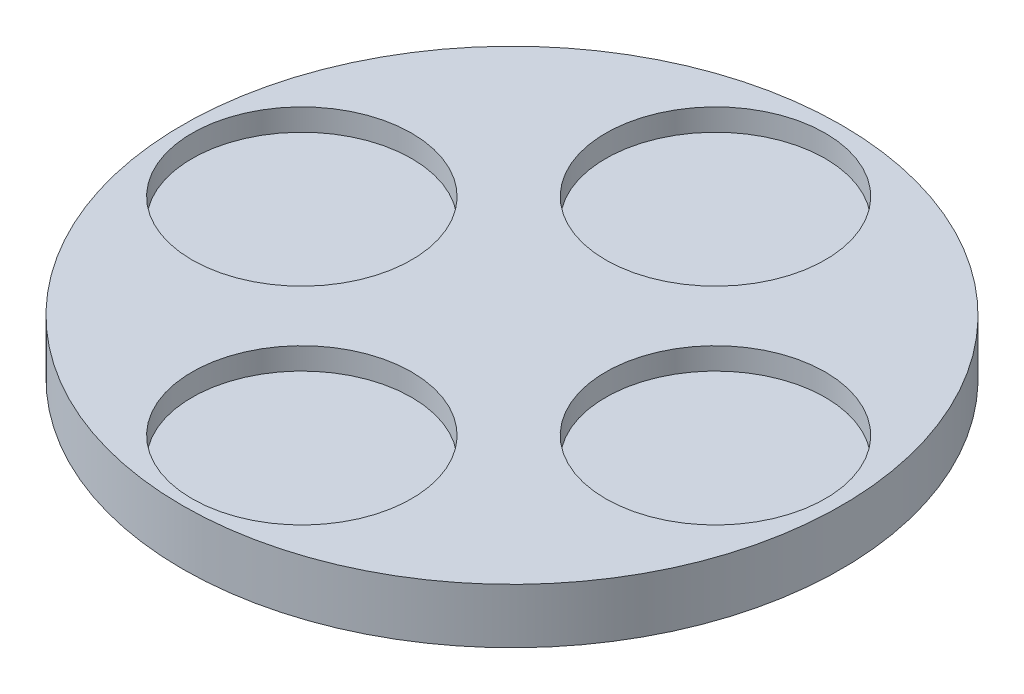
ISO-10303-21;
HEADER;
FILE_DESCRIPTION(('STEP AP214'),'2;1');
FILE_NAME('part.step','',(''),(''),'','','');
FILE_SCHEMA(('AUTOMOTIVE_DESIGN { 1 0 10303 214 1 1 1 1 }'));
ENDSEC;
DATA;
#1=APPLICATION_CONTEXT('core data for automotive mechanical design processes');
#2=APPLICATION_PROTOCOL_DEFINITION('international standard','automotive_design',2000,#1);
#3=PRODUCT_CONTEXT('',#1,'mechanical');
#4=PRODUCT('Part','Part','',(#3));
#5=PRODUCT_RELATED_PRODUCT_CATEGORY('part','',(#4));
#6=PRODUCT_DEFINITION_FORMATION('','',#4);
#7=PRODUCT_DEFINITION_CONTEXT('part definition',#1,'design');
#8=PRODUCT_DEFINITION('design','',#6,#7);
#9=PRODUCT_DEFINITION_SHAPE('','',#8);
#10=(LENGTH_UNIT() NAMED_UNIT(*) SI_UNIT(.MILLI.,.METRE.));
#11=(NAMED_UNIT(*) PLANE_ANGLE_UNIT() SI_UNIT($,.RADIAN.));
#12=(NAMED_UNIT(*) SI_UNIT($,.STERADIAN.) SOLID_ANGLE_UNIT());
#13=UNCERTAINTY_MEASURE_WITH_UNIT(LENGTH_MEASURE(1.E-05),#10,'distance_accuracy_value','');
#14=(GEOMETRIC_REPRESENTATION_CONTEXT(3) GLOBAL_UNCERTAINTY_ASSIGNED_CONTEXT((#13)) GLOBAL_UNIT_ASSIGNED_CONTEXT((#10,
#11,#12)) REPRESENTATION_CONTEXT('',''));
#15=CARTESIAN_POINT('',(0.,0.,0.));
#16=DIRECTION('',(0.,0.,1.));
#17=DIRECTION('',(1.,0.,0.));
#18=AXIS2_PLACEMENT_3D('',#15,#16,#17);
#19=CARTESIAN_POINT('',(0.257754176952257,12.7,-0.515508353904612));
#20=DIRECTION('',(0.,-1.,0.));
#21=DIRECTION('',(0.,0.,-1.));
#22=AXIS2_PLACEMENT_3D('',#19,#20,#21);
#23=CYLINDRICAL_SURFACE('',#22,76.2272844085496);
#24=CARTESIAN_POINT('',(0.257754176952257,12.7,-0.515508353904612));
#25=DIRECTION('',(0.,1.,0.));
#26=DIRECTION('',(0.,0.,1.));
#27=AXIS2_PLACEMENT_3D('',#24,#25,#26);
#28=CIRCLE('',#27,76.2272844085496);
#29=CARTESIAN_POINT('',(0.257754176952257,12.7,75.711776054645));
#30=VERTEX_POINT('',#29);
#31=EDGE_CURVE('E11',#30,#30,#28,.T.);
#32=ORIENTED_EDGE('',*,*,#31,.F.);
#33=EDGE_LOOP('',(#32));
#34=FACE_BOUND('',#33,.T.);
#35=CARTESIAN_POINT('',(0.257754176952257,0.,-0.515508353904612));
#36=DIRECTION('',(0.,1.,0.));
#37=DIRECTION('',(0.,0.,1.));
#38=AXIS2_PLACEMENT_3D('',#35,#36,#37);
#39=CIRCLE('',#38,76.2272844085496);
#40=CARTESIAN_POINT('',(0.257754176952257,0.,75.711776054645));
#41=VERTEX_POINT('',#40);
#42=EDGE_CURVE('E50',#41,#41,#39,.T.);
#43=ORIENTED_EDGE('',*,*,#42,.T.);
#44=EDGE_LOOP('',(#43));
#45=FACE_BOUND('',#44,.T.);
#46=ADVANCED_FACE('F47',(#34,#45),#23,.T.);
#47=CARTESIAN_POINT('',(0.257754176952257,12.7,-0.515508353904612));
#48=DIRECTION('',(0.,1.,0.));
#49=DIRECTION('',(0.,0.,1.));
#50=AXIS2_PLACEMENT_3D('',#47,#48,#49);
#51=PLANE('',#50);
#52=CARTESIAN_POINT('',(47.837919056,12.7,0.));
#53=DIRECTION('',(0.,1.,0.));
#54=DIRECTION('',(0.,0.,1.));
#55=AXIS2_PLACEMENT_3D('',#52,#53,#54);
#56=CIRCLE('',#55,25.4);
#57=CARTESIAN_POINT('',(47.837919056,12.7,25.4));
#58=VERTEX_POINT('',#57);
#59=EDGE_CURVE('E68',#58,#58,#56,.T.);
#60=ORIENTED_EDGE('',*,*,#59,.F.);
#61=EDGE_LOOP('',(#60));
#62=FACE_BOUND('',#61,.T.);
#63=CARTESIAN_POINT('',(0.,12.7,47.837919056));
#64=DIRECTION('',(0.,1.,0.));
#65=DIRECTION('',(0.,0.,1.));
#66=AXIS2_PLACEMENT_3D('',#63,#64,#65);
#67=CIRCLE('',#66,25.4);
#68=CARTESIAN_POINT('',(0.,12.7,73.237919056));
#69=VERTEX_POINT('',#68);
#70=EDGE_CURVE('E74',#69,#69,#67,.T.);
#71=ORIENTED_EDGE('',*,*,#70,.F.);
#72=EDGE_LOOP('',(#71));
#73=FACE_BOUND('',#72,.T.);
#74=CARTESIAN_POINT('',(0.,12.7,-47.837919056));
#75=DIRECTION('',(0.,1.,0.));
#76=DIRECTION('',(0.,0.,1.));
#77=AXIS2_PLACEMENT_3D('',#74,#75,#76);
#78=CIRCLE('',#77,25.4);
#79=CARTESIAN_POINT('',(0.,12.7,-22.437919056));
#80=VERTEX_POINT('',#79);
#81=EDGE_CURVE('E65',#80,#80,#78,.T.);
#82=ORIENTED_EDGE('',*,*,#81,.F.);
#83=EDGE_LOOP('',(#82));
#84=FACE_BOUND('',#83,.T.);
#85=CARTESIAN_POINT('',(-47.837919056,12.7,0.));
#86=DIRECTION('',(0.,1.,0.));
#87=DIRECTION('',(0.,0.,1.));
#88=AXIS2_PLACEMENT_3D('',#85,#86,#87);
#89=CIRCLE('',#88,25.4);
#90=CARTESIAN_POINT('',(-47.837919056,12.7,25.4));
#91=VERTEX_POINT('',#90);
#92=EDGE_CURVE('E59',#91,#91,#89,.T.);
#93=ORIENTED_EDGE('',*,*,#92,.F.);
#94=EDGE_LOOP('',(#93));
#95=FACE_BOUND('',#94,.T.);
#96=ORIENTED_EDGE('',*,*,#31,.T.);
#97=EDGE_LOOP('',(#96));
#98=FACE_BOUND('',#97,.T.);
#99=ADVANCED_FACE('F85',(#62,#73,#84,#95,#98),#51,.T.);
#100=CARTESIAN_POINT('',(0.257754176952257,0.,-0.515508353904612));
#101=DIRECTION('',(0.,1.,0.));
#102=DIRECTION('',(0.,0.,1.));
#103=AXIS2_PLACEMENT_3D('',#100,#101,#102);
#104=PLANE('',#103);
#105=ORIENTED_EDGE('',*,*,#42,.F.);
#106=EDGE_LOOP('',(#105));
#107=FACE_BOUND('',#106,.T.);
#108=ADVANCED_FACE('F88',(#107),#104,.F.);
#109=CARTESIAN_POINT('',(-47.837919056,7.62000000000002,0.));
#110=DIRECTION('',(0.,1.,0.));
#111=DIRECTION('',(0.,0.,1.));
#112=AXIS2_PLACEMENT_3D('',#109,#110,#111);
#113=CYLINDRICAL_SURFACE('',#112,25.4);
#114=CARTESIAN_POINT('',(-47.837919056,7.62000000000002,0.));
#115=DIRECTION('',(0.,1.,0.));
#116=DIRECTION('',(0.,0.,1.));
#117=AXIS2_PLACEMENT_3D('',#114,#115,#116);
#118=CIRCLE('',#117,25.4);
#119=CARTESIAN_POINT('',(-47.837919056,7.62000000000002,25.4));
#120=VERTEX_POINT('',#119);
#121=EDGE_CURVE('E57',#120,#120,#118,.T.);
#122=CARTESIAN_POINT('',(-47.837919056,7.62000000000002,25.4));
#123=CARTESIAN_POINT('',(-47.837919056,7.67291666666668,25.4));
#124=CARTESIAN_POINT('',(-47.837919056,7.72583333333335,25.4));
#125=CARTESIAN_POINT('',(-47.837919056,7.83166666666668,25.4));
#126=CARTESIAN_POINT('',(-47.837919056,7.88458333333335,25.4));
#127=CARTESIAN_POINT('',(-47.837919056,7.99041666666668,25.4));
#128=CARTESIAN_POINT('',(-47.837919056,8.04333333333335,25.4));
#129=CARTESIAN_POINT('',(-47.837919056,8.14916666666668,25.4));
#130=CARTESIAN_POINT('',(-47.837919056,8.20208333333334,25.4));
#131=CARTESIAN_POINT('',(-47.837919056,8.30791666666668,25.4));
#132=CARTESIAN_POINT('',(-47.837919056,8.36083333333334,25.4));
#133=CARTESIAN_POINT('',(-47.837919056,8.46666666666668,25.4));
#134=CARTESIAN_POINT('',(-47.837919056,8.51958333333334,25.4));
#135=CARTESIAN_POINT('',(-47.837919056,8.62541666666668,25.4));
#136=CARTESIAN_POINT('',(-47.837919056,8.67833333333334,25.4));
#137=CARTESIAN_POINT('',(-47.837919056,8.78416666666667,25.4));
#138=CARTESIAN_POINT('',(-47.837919056,8.83708333333334,25.4));
#139=CARTESIAN_POINT('',(-47.837919056,8.94291666666667,25.4));
#140=CARTESIAN_POINT('',(-47.837919056,8.99583333333334,25.4));
#141=CARTESIAN_POINT('',(-47.837919056,9.10166666666667,25.4));
#142=CARTESIAN_POINT('',(-47.837919056,9.15458333333334,25.4));
#143=CARTESIAN_POINT('',(-47.837919056,9.26041666666667,25.4));
#144=CARTESIAN_POINT('',(-47.837919056,9.31333333333334,25.4));
#145=CARTESIAN_POINT('',(-47.837919056,9.41916666666667,25.4));
#146=CARTESIAN_POINT('',(-47.837919056,9.47208333333334,25.4));
#147=CARTESIAN_POINT('',(-47.837919056,9.57791666666667,25.4));
#148=CARTESIAN_POINT('',(-47.837919056,9.63083333333334,25.4));
#149=CARTESIAN_POINT('',(-47.837919056,9.73666666666667,25.4));
#150=CARTESIAN_POINT('',(-47.837919056,9.78958333333333,25.4));
#151=CARTESIAN_POINT('',(-47.837919056,9.89541666666667,25.4));
#152=CARTESIAN_POINT('',(-47.837919056,9.94833333333333,25.4));
#153=CARTESIAN_POINT('',(-47.837919056,10.0541666666667,25.4));
#154=CARTESIAN_POINT('',(-47.837919056,10.1070833333333,25.4));
#155=CARTESIAN_POINT('',(-47.837919056,10.2129166666667,25.4));
#156=CARTESIAN_POINT('',(-47.837919056,10.2658333333333,25.4));
#157=CARTESIAN_POINT('',(-47.837919056,10.3716666666667,25.4));
#158=CARTESIAN_POINT('',(-47.837919056,10.4245833333333,25.4));
#159=CARTESIAN_POINT('',(-47.837919056,10.5304166666667,25.4));
#160=CARTESIAN_POINT('',(-47.837919056,10.5833333333333,25.4));
#161=CARTESIAN_POINT('',(-47.837919056,10.6891666666667,25.4));
#162=CARTESIAN_POINT('',(-47.837919056,10.7420833333333,25.4));
#163=CARTESIAN_POINT('',(-47.837919056,10.8479166666667,25.4));
#164=CARTESIAN_POINT('',(-47.837919056,10.9008333333333,25.4));
#165=CARTESIAN_POINT('',(-47.837919056,11.0066666666667,25.4));
#166=CARTESIAN_POINT('',(-47.837919056,11.0595833333333,25.4));
#167=CARTESIAN_POINT('',(-47.837919056,11.1654166666667,25.4));
#168=CARTESIAN_POINT('',(-47.837919056,11.2183333333333,25.4));
#169=CARTESIAN_POINT('',(-47.837919056,11.3241666666667,25.4));
#170=CARTESIAN_POINT('',(-47.837919056,11.3770833333333,25.4));
#171=CARTESIAN_POINT('',(-47.837919056,11.4829166666667,25.4));
#172=CARTESIAN_POINT('',(-47.837919056,11.5358333333333,25.4));
#173=CARTESIAN_POINT('',(-47.837919056,11.6416666666667,25.4));
#174=CARTESIAN_POINT('',(-47.837919056,11.6945833333333,25.4));
#175=CARTESIAN_POINT('',(-47.837919056,11.8004166666667,25.4));
#176=CARTESIAN_POINT('',(-47.837919056,11.8533333333333,25.4));
#177=CARTESIAN_POINT('',(-47.837919056,11.9591666666667,25.4));
#178=CARTESIAN_POINT('',(-47.837919056,12.0120833333333,25.4));
#179=CARTESIAN_POINT('',(-47.837919056,12.1179166666667,25.4));
#180=CARTESIAN_POINT('',(-47.837919056,12.1708333333333,25.4));
#181=CARTESIAN_POINT('',(-47.837919056,12.2766666666667,25.4));
#182=CARTESIAN_POINT('',(-47.837919056,12.3295833333333,25.4));
#183=CARTESIAN_POINT('',(-47.837919056,12.4354166666667,25.4));
#184=CARTESIAN_POINT('',(-47.837919056,12.4883333333333,25.4));
#185=CARTESIAN_POINT('',(-47.837919056,12.5941666666666,25.4));
#186=CARTESIAN_POINT('',(-47.837919056,12.6470833333333,25.4));
#187=CARTESIAN_POINT('',(-47.837919056,12.7,25.4));
#188=B_SPLINE_CURVE_WITH_KNOTS('',3,(#122,#123,#124,#125,#126,#127,#128,#129,#130,#131,#132,
#133,#134,#135,#136,#137,#138,#139,#140,#141,#142,#143,#144,#145,#146,#147,#148,#149,#150,#151,
#152,#153,#154,#155,#156,#157,#158,#159,#160,#161,#162,#163,#164,#165,#166,#167,#168,#169,#170,
#171,#172,#173,#174,#175,#176,#177,#178,#179,#180,#181,#182,#183,#184,#185,#186,#187),
.UNSPECIFIED.,.F.,.F.,(4,2,2,2,2,2,2,2,2,2,2,2,2,2,2,2,2,2,2,2,2,2,2,2,2,2,2,2,2,2,2,2,4),(0.,
0.158749999999998,0.317499999999997,0.476249999999996,0.634999999999995,0.793749999999994,
0.952499999999993,1.11124999999999,1.26999999999999,1.42874999999999,1.58749999999999,
1.74624999999999,1.90499999999999,2.06374999999999,2.22249999999999,2.38124999999998,
2.53999999999998,2.69874999999998,2.85749999999998,3.01624999999998,3.17499999999998,
3.33374999999998,3.49249999999998,3.65124999999997,3.80999999999997,3.96874999999997,
4.12749999999997,4.28624999999997,4.44499999999997,4.60374999999997,4.76249999999997,
4.92124999999997,5.07999999999997),.UNSPECIFIED.);
#189=EDGE_CURVE('BSEAM95',#120,#91,#188,.T.);
#190=ORIENTED_EDGE('',*,*,#121,.F.);
#191=ORIENTED_EDGE('',*,*,#92,.T.);
#192=ORIENTED_EDGE('',*,*,#189,.T.);
#193=ORIENTED_EDGE('',*,*,#189,.F.);
#194=EDGE_LOOP('',(#190,#192,#191,#193));
#195=FACE_BOUND('',#194,.T.);
#196=ADVANCED_FACE('F95',(#195),#113,.F.);
#197=CARTESIAN_POINT('',(-47.837919056,7.62000000000002,0.));
#198=DIRECTION('',(0.,1.,0.));
#199=DIRECTION('',(0.,0.,1.));
#200=AXIS2_PLACEMENT_3D('',#197,#198,#199);
#201=PLANE('',#200);
#202=ORIENTED_EDGE('',*,*,#121,.T.);
#203=EDGE_LOOP('',(#202));
#204=FACE_BOUND('',#203,.T.);
#205=ADVANCED_FACE('F97',(#204),#201,.T.);
#206=CARTESIAN_POINT('',(0.,7.62000000000002,-47.837919056));
#207=DIRECTION('',(0.,1.,0.));
#208=DIRECTION('',(0.,0.,1.));
#209=AXIS2_PLACEMENT_3D('',#206,#207,#208);
#210=CYLINDRICAL_SURFACE('',#209,25.4);
#211=CARTESIAN_POINT('',(0.,7.62000000000002,-47.837919056));
#212=DIRECTION('',(0.,1.,0.));
#213=DIRECTION('',(0.,0.,1.));
#214=AXIS2_PLACEMENT_3D('',#211,#212,#213);
#215=CIRCLE('',#214,25.4);
#216=CARTESIAN_POINT('',(0.,7.62000000000002,-22.437919056));
#217=VERTEX_POINT('',#216);
#218=EDGE_CURVE('E62',#217,#217,#215,.T.);
#219=CARTESIAN_POINT('',(0.,7.62000000000002,-22.437919056));
#220=CARTESIAN_POINT('',(0.,7.67291666666668,-22.437919056));
#221=CARTESIAN_POINT('',(0.,7.72583333333335,-22.437919056));
#222=CARTESIAN_POINT('',(0.,7.83166666666668,-22.437919056));
#223=CARTESIAN_POINT('',(0.,7.88458333333335,-22.437919056));
#224=CARTESIAN_POINT('',(0.,7.99041666666668,-22.437919056));
#225=CARTESIAN_POINT('',(0.,8.04333333333335,-22.437919056));
#226=CARTESIAN_POINT('',(0.,8.14916666666668,-22.437919056));
#227=CARTESIAN_POINT('',(0.,8.20208333333334,-22.437919056));
#228=CARTESIAN_POINT('',(0.,8.30791666666668,-22.437919056));
#229=CARTESIAN_POINT('',(0.,8.36083333333334,-22.437919056));
#230=CARTESIAN_POINT('',(0.,8.46666666666668,-22.437919056));
#231=CARTESIAN_POINT('',(0.,8.51958333333334,-22.437919056));
#232=CARTESIAN_POINT('',(0.,8.62541666666668,-22.437919056));
#233=CARTESIAN_POINT('',(0.,8.67833333333334,-22.437919056));
#234=CARTESIAN_POINT('',(0.,8.78416666666667,-22.437919056));
#235=CARTESIAN_POINT('',(0.,8.83708333333334,-22.437919056));
#236=CARTESIAN_POINT('',(0.,8.94291666666667,-22.437919056));
#237=CARTESIAN_POINT('',(0.,8.99583333333334,-22.437919056));
#238=CARTESIAN_POINT('',(0.,9.10166666666667,-22.437919056));
#239=CARTESIAN_POINT('',(0.,9.15458333333334,-22.437919056));
#240=CARTESIAN_POINT('',(0.,9.26041666666667,-22.437919056));
#241=CARTESIAN_POINT('',(0.,9.31333333333334,-22.437919056));
#242=CARTESIAN_POINT('',(0.,9.41916666666667,-22.437919056));
#243=CARTESIAN_POINT('',(0.,9.47208333333334,-22.437919056));
#244=CARTESIAN_POINT('',(0.,9.57791666666667,-22.437919056));
#245=CARTESIAN_POINT('',(0.,9.63083333333334,-22.437919056));
#246=CARTESIAN_POINT('',(0.,9.73666666666667,-22.437919056));
#247=CARTESIAN_POINT('',(0.,9.78958333333333,-22.437919056));
#248=CARTESIAN_POINT('',(0.,9.89541666666667,-22.437919056));
#249=CARTESIAN_POINT('',(0.,9.94833333333333,-22.437919056));
#250=CARTESIAN_POINT('',(0.,10.0541666666667,-22.437919056));
#251=CARTESIAN_POINT('',(0.,10.1070833333333,-22.437919056));
#252=CARTESIAN_POINT('',(0.,10.2129166666667,-22.437919056));
#253=CARTESIAN_POINT('',(0.,10.2658333333333,-22.437919056));
#254=CARTESIAN_POINT('',(0.,10.3716666666667,-22.437919056));
#255=CARTESIAN_POINT('',(0.,10.4245833333333,-22.437919056));
#256=CARTESIAN_POINT('',(0.,10.5304166666667,-22.437919056));
#257=CARTESIAN_POINT('',(0.,10.5833333333333,-22.437919056));
#258=CARTESIAN_POINT('',(0.,10.6891666666667,-22.437919056));
#259=CARTESIAN_POINT('',(0.,10.7420833333333,-22.437919056));
#260=CARTESIAN_POINT('',(0.,10.8479166666667,-22.437919056));
#261=CARTESIAN_POINT('',(0.,10.9008333333333,-22.437919056));
#262=CARTESIAN_POINT('',(0.,11.0066666666667,-22.437919056));
#263=CARTESIAN_POINT('',(0.,11.0595833333333,-22.437919056));
#264=CARTESIAN_POINT('',(0.,11.1654166666667,-22.437919056));
#265=CARTESIAN_POINT('',(0.,11.2183333333333,-22.437919056));
#266=CARTESIAN_POINT('',(0.,11.3241666666667,-22.437919056));
#267=CARTESIAN_POINT('',(0.,11.3770833333333,-22.437919056));
#268=CARTESIAN_POINT('',(0.,11.4829166666667,-22.437919056));
#269=CARTESIAN_POINT('',(0.,11.5358333333333,-22.437919056));
#270=CARTESIAN_POINT('',(0.,11.6416666666667,-22.437919056));
#271=CARTESIAN_POINT('',(0.,11.6945833333333,-22.437919056));
#272=CARTESIAN_POINT('',(0.,11.8004166666667,-22.437919056));
#273=CARTESIAN_POINT('',(0.,11.8533333333333,-22.437919056));
#274=CARTESIAN_POINT('',(0.,11.9591666666667,-22.437919056));
#275=CARTESIAN_POINT('',(0.,12.0120833333333,-22.437919056));
#276=CARTESIAN_POINT('',(0.,12.1179166666667,-22.437919056));
#277=CARTESIAN_POINT('',(0.,12.1708333333333,-22.437919056));
#278=CARTESIAN_POINT('',(0.,12.2766666666667,-22.437919056));
#279=CARTESIAN_POINT('',(0.,12.3295833333333,-22.437919056));
#280=CARTESIAN_POINT('',(0.,12.4354166666667,-22.437919056));
#281=CARTESIAN_POINT('',(0.,12.4883333333333,-22.437919056));
#282=CARTESIAN_POINT('',(0.,12.5941666666666,-22.437919056));
#283=CARTESIAN_POINT('',(0.,12.6470833333333,-22.437919056));
#284=CARTESIAN_POINT('',(0.,12.7,-22.437919056));
#285=B_SPLINE_CURVE_WITH_KNOTS('',3,(#219,#220,#221,#222,#223,#224,#225,#226,#227,#228,#229,
#230,#231,#232,#233,#234,#235,#236,#237,#238,#239,#240,#241,#242,#243,#244,#245,#246,#247,#248,
#249,#250,#251,#252,#253,#254,#255,#256,#257,#258,#259,#260,#261,#262,#263,#264,#265,#266,#267,
#268,#269,#270,#271,#272,#273,#274,#275,#276,#277,#278,#279,#280,#281,#282,#283,#284),
.UNSPECIFIED.,.F.,.F.,(4,2,2,2,2,2,2,2,2,2,2,2,2,2,2,2,2,2,2,2,2,2,2,2,2,2,2,2,2,2,2,2,4),(0.,
0.158749999999998,0.317499999999997,0.476249999999996,0.634999999999995,0.793749999999994,
0.952499999999993,1.11124999999999,1.26999999999999,1.42874999999999,1.58749999999999,
1.74624999999999,1.90499999999999,2.06374999999999,2.22249999999999,2.38124999999998,
2.53999999999998,2.69874999999998,2.85749999999998,3.01624999999998,3.17499999999998,
3.33374999999998,3.49249999999998,3.65124999999997,3.80999999999997,3.96874999999997,
4.12749999999997,4.28624999999997,4.44499999999997,4.60374999999997,4.76249999999997,
4.92124999999997,5.07999999999997),.UNSPECIFIED.);
#286=EDGE_CURVE('BSEAM104',#217,#80,#285,.T.);
#287=ORIENTED_EDGE('',*,*,#218,.F.);
#288=ORIENTED_EDGE('',*,*,#81,.T.);
#289=ORIENTED_EDGE('',*,*,#286,.T.);
#290=ORIENTED_EDGE('',*,*,#286,.F.);
#291=EDGE_LOOP('',(#287,#289,#288,#290));
#292=FACE_BOUND('',#291,.T.);
#293=ADVANCED_FACE('F104',(#292),#210,.F.);
#294=CARTESIAN_POINT('',(0.,7.62000000000002,-47.837919056));
#295=DIRECTION('',(0.,1.,0.));
#296=DIRECTION('',(0.,0.,1.));
#297=AXIS2_PLACEMENT_3D('',#294,#295,#296);
#298=PLANE('',#297);
#299=ORIENTED_EDGE('',*,*,#218,.T.);
#300=EDGE_LOOP('',(#299));
#301=FACE_BOUND('',#300,.T.);
#302=ADVANCED_FACE('F142',(#301),#298,.T.);
#303=CARTESIAN_POINT('',(0.,7.62000000000002,47.837919056));
#304=DIRECTION('',(0.,1.,0.));
#305=DIRECTION('',(0.,0.,1.));
#306=AXIS2_PLACEMENT_3D('',#303,#304,#305);
#307=CYLINDRICAL_SURFACE('',#306,25.4);
#308=CARTESIAN_POINT('',(0.,7.62000000000002,47.837919056));
#309=DIRECTION('',(0.,1.,0.));
#310=DIRECTION('',(0.,0.,1.));
#311=AXIS2_PLACEMENT_3D('',#308,#309,#310);
#312=CIRCLE('',#311,25.4);
#313=CARTESIAN_POINT('',(0.,7.62000000000002,73.237919056));
#314=VERTEX_POINT('',#313);
#315=EDGE_CURVE('E77',#314,#314,#312,.T.);
#316=CARTESIAN_POINT('',(0.,7.62000000000002,73.237919056));
#317=CARTESIAN_POINT('',(0.,7.67291666666668,73.237919056));
#318=CARTESIAN_POINT('',(0.,7.72583333333335,73.237919056));
#319=CARTESIAN_POINT('',(0.,7.83166666666668,73.237919056));
#320=CARTESIAN_POINT('',(0.,7.88458333333335,73.237919056));
#321=CARTESIAN_POINT('',(0.,7.99041666666668,73.237919056));
#322=CARTESIAN_POINT('',(0.,8.04333333333335,73.237919056));
#323=CARTESIAN_POINT('',(0.,8.14916666666668,73.237919056));
#324=CARTESIAN_POINT('',(0.,8.20208333333334,73.237919056));
#325=CARTESIAN_POINT('',(0.,8.30791666666668,73.237919056));
#326=CARTESIAN_POINT('',(0.,8.36083333333334,73.237919056));
#327=CARTESIAN_POINT('',(0.,8.46666666666668,73.237919056));
#328=CARTESIAN_POINT('',(0.,8.51958333333334,73.237919056));
#329=CARTESIAN_POINT('',(0.,8.62541666666668,73.237919056));
#330=CARTESIAN_POINT('',(0.,8.67833333333334,73.237919056));
#331=CARTESIAN_POINT('',(0.,8.78416666666667,73.237919056));
#332=CARTESIAN_POINT('',(0.,8.83708333333334,73.237919056));
#333=CARTESIAN_POINT('',(0.,8.94291666666667,73.237919056));
#334=CARTESIAN_POINT('',(0.,8.99583333333334,73.237919056));
#335=CARTESIAN_POINT('',(0.,9.10166666666667,73.237919056));
#336=CARTESIAN_POINT('',(0.,9.15458333333334,73.237919056));
#337=CARTESIAN_POINT('',(0.,9.26041666666667,73.237919056));
#338=CARTESIAN_POINT('',(0.,9.31333333333334,73.237919056));
#339=CARTESIAN_POINT('',(0.,9.41916666666667,73.237919056));
#340=CARTESIAN_POINT('',(0.,9.47208333333334,73.237919056));
#341=CARTESIAN_POINT('',(0.,9.57791666666667,73.237919056));
#342=CARTESIAN_POINT('',(0.,9.63083333333334,73.237919056));
#343=CARTESIAN_POINT('',(0.,9.73666666666667,73.237919056));
#344=CARTESIAN_POINT('',(0.,9.78958333333333,73.237919056));
#345=CARTESIAN_POINT('',(0.,9.89541666666667,73.237919056));
#346=CARTESIAN_POINT('',(0.,9.94833333333333,73.237919056));
#347=CARTESIAN_POINT('',(0.,10.0541666666667,73.237919056));
#348=CARTESIAN_POINT('',(0.,10.1070833333333,73.237919056));
#349=CARTESIAN_POINT('',(0.,10.2129166666667,73.237919056));
#350=CARTESIAN_POINT('',(0.,10.2658333333333,73.237919056));
#351=CARTESIAN_POINT('',(0.,10.3716666666667,73.237919056));
#352=CARTESIAN_POINT('',(0.,10.4245833333333,73.237919056));
#353=CARTESIAN_POINT('',(0.,10.5304166666667,73.237919056));
#354=CARTESIAN_POINT('',(0.,10.5833333333333,73.237919056));
#355=CARTESIAN_POINT('',(0.,10.6891666666667,73.237919056));
#356=CARTESIAN_POINT('',(0.,10.7420833333333,73.237919056));
#357=CARTESIAN_POINT('',(0.,10.8479166666667,73.237919056));
#358=CARTESIAN_POINT('',(0.,10.9008333333333,73.237919056));
#359=CARTESIAN_POINT('',(0.,11.0066666666667,73.237919056));
#360=CARTESIAN_POINT('',(0.,11.0595833333333,73.237919056));
#361=CARTESIAN_POINT('',(0.,11.1654166666667,73.237919056));
#362=CARTESIAN_POINT('',(0.,11.2183333333333,73.237919056));
#363=CARTESIAN_POINT('',(0.,11.3241666666667,73.237919056));
#364=CARTESIAN_POINT('',(0.,11.3770833333333,73.237919056));
#365=CARTESIAN_POINT('',(0.,11.4829166666667,73.237919056));
#366=CARTESIAN_POINT('',(0.,11.5358333333333,73.237919056));
#367=CARTESIAN_POINT('',(0.,11.6416666666667,73.237919056));
#368=CARTESIAN_POINT('',(0.,11.6945833333333,73.237919056));
#369=CARTESIAN_POINT('',(0.,11.8004166666667,73.237919056));
#370=CARTESIAN_POINT('',(0.,11.8533333333333,73.237919056));
#371=CARTESIAN_POINT('',(0.,11.9591666666667,73.237919056));
#372=CARTESIAN_POINT('',(0.,12.0120833333333,73.237919056));
#373=CARTESIAN_POINT('',(0.,12.1179166666667,73.237919056));
#374=CARTESIAN_POINT('',(0.,12.1708333333333,73.237919056));
#375=CARTESIAN_POINT('',(0.,12.2766666666667,73.237919056));
#376=CARTESIAN_POINT('',(0.,12.3295833333333,73.237919056));
#377=CARTESIAN_POINT('',(0.,12.4354166666667,73.237919056));
#378=CARTESIAN_POINT('',(0.,12.4883333333333,73.237919056));
#379=CARTESIAN_POINT('',(0.,12.5941666666666,73.237919056));
#380=CARTESIAN_POINT('',(0.,12.6470833333333,73.237919056));
#381=CARTESIAN_POINT('',(0.,12.7,73.237919056));
#382=B_SPLINE_CURVE_WITH_KNOTS('',3,(#316,#317,#318,#319,#320,#321,#322,#323,#324,#325,#326,
#327,#328,#329,#330,#331,#332,#333,#334,#335,#336,#337,#338,#339,#340,#341,#342,#343,#344,#345,
#346,#347,#348,#349,#350,#351,#352,#353,#354,#355,#356,#357,#358,#359,#360,#361,#362,#363,#364,
#365,#366,#367,#368,#369,#370,#371,#372,#373,#374,#375,#376,#377,#378,#379,#380,#381),
.UNSPECIFIED.,.F.,.F.,(4,2,2,2,2,2,2,2,2,2,2,2,2,2,2,2,2,2,2,2,2,2,2,2,2,2,2,2,2,2,2,2,4),(0.,
0.158749999999998,0.317499999999997,0.476249999999996,0.634999999999995,0.793749999999994,
0.952499999999993,1.11124999999999,1.26999999999999,1.42874999999999,1.58749999999999,
1.74624999999999,1.90499999999999,2.06374999999999,2.22249999999999,2.38124999999998,
2.53999999999998,2.69874999999998,2.85749999999998,3.01624999999998,3.17499999999998,
3.33374999999998,3.49249999999998,3.65124999999997,3.80999999999997,3.96874999999997,
4.12749999999997,4.28624999999997,4.44499999999997,4.60374999999997,4.76249999999997,
4.92124999999997,5.07999999999997),.UNSPECIFIED.);
#383=EDGE_CURVE('BSEAM83',#314,#69,#382,.T.);
#384=ORIENTED_EDGE('',*,*,#315,.F.);
#385=ORIENTED_EDGE('',*,*,#70,.T.);
#386=ORIENTED_EDGE('',*,*,#383,.T.);
#387=ORIENTED_EDGE('',*,*,#383,.F.);
#388=EDGE_LOOP('',(#384,#386,#385,#387));
#389=FACE_BOUND('',#388,.T.);
#390=ADVANCED_FACE('F83',(#389),#307,.F.);
#391=CARTESIAN_POINT('',(0.,7.62000000000002,47.837919056));
#392=DIRECTION('',(0.,1.,0.));
#393=DIRECTION('',(0.,0.,1.));
#394=AXIS2_PLACEMENT_3D('',#391,#392,#393);
#395=PLANE('',#394);
#396=ORIENTED_EDGE('',*,*,#315,.T.);
#397=EDGE_LOOP('',(#396));
#398=FACE_BOUND('',#397,.T.);
#399=ADVANCED_FACE('F156',(#398),#395,.T.);
#400=CARTESIAN_POINT('',(47.837919056,7.62000000000002,0.));
#401=DIRECTION('',(0.,1.,0.));
#402=DIRECTION('',(0.,0.,1.));
#403=AXIS2_PLACEMENT_3D('',#400,#401,#402);
#404=CYLINDRICAL_SURFACE('',#403,25.4);
#405=CARTESIAN_POINT('',(47.837919056,7.62000000000002,0.));
#406=DIRECTION('',(0.,1.,0.));
#407=DIRECTION('',(0.,0.,1.));
#408=AXIS2_PLACEMENT_3D('',#405,#406,#407);
#409=CIRCLE('',#408,25.4);
#410=CARTESIAN_POINT('',(47.837919056,7.62000000000002,25.4));
#411=VERTEX_POINT('',#410);
#412=EDGE_CURVE('E71',#411,#411,#409,.T.);
#413=CARTESIAN_POINT('',(47.837919056,7.62000000000002,25.4));
#414=CARTESIAN_POINT('',(47.837919056,7.67291666666668,25.4));
#415=CARTESIAN_POINT('',(47.837919056,7.72583333333335,25.4));
#416=CARTESIAN_POINT('',(47.837919056,7.83166666666668,25.4));
#417=CARTESIAN_POINT('',(47.837919056,7.88458333333335,25.4));
#418=CARTESIAN_POINT('',(47.837919056,7.99041666666668,25.4));
#419=CARTESIAN_POINT('',(47.837919056,8.04333333333335,25.4));
#420=CARTESIAN_POINT('',(47.837919056,8.14916666666668,25.4));
#421=CARTESIAN_POINT('',(47.837919056,8.20208333333334,25.4));
#422=CARTESIAN_POINT('',(47.837919056,8.30791666666668,25.4));
#423=CARTESIAN_POINT('',(47.837919056,8.36083333333334,25.4));
#424=CARTESIAN_POINT('',(47.837919056,8.46666666666668,25.4));
#425=CARTESIAN_POINT('',(47.837919056,8.51958333333334,25.4));
#426=CARTESIAN_POINT('',(47.837919056,8.62541666666668,25.4));
#427=CARTESIAN_POINT('',(47.837919056,8.67833333333334,25.4));
#428=CARTESIAN_POINT('',(47.837919056,8.78416666666667,25.4));
#429=CARTESIAN_POINT('',(47.837919056,8.83708333333334,25.4));
#430=CARTESIAN_POINT('',(47.837919056,8.94291666666667,25.4));
#431=CARTESIAN_POINT('',(47.837919056,8.99583333333334,25.4));
#432=CARTESIAN_POINT('',(47.837919056,9.10166666666667,25.4));
#433=CARTESIAN_POINT('',(47.837919056,9.15458333333334,25.4));
#434=CARTESIAN_POINT('',(47.837919056,9.26041666666667,25.4));
#435=CARTESIAN_POINT('',(47.837919056,9.31333333333334,25.4));
#436=CARTESIAN_POINT('',(47.837919056,9.41916666666667,25.4));
#437=CARTESIAN_POINT('',(47.837919056,9.47208333333334,25.4));
#438=CARTESIAN_POINT('',(47.837919056,9.57791666666667,25.4));
#439=CARTESIAN_POINT('',(47.837919056,9.63083333333334,25.4));
#440=CARTESIAN_POINT('',(47.837919056,9.73666666666667,25.4));
#441=CARTESIAN_POINT('',(47.837919056,9.78958333333333,25.4));
#442=CARTESIAN_POINT('',(47.837919056,9.89541666666667,25.4));
#443=CARTESIAN_POINT('',(47.837919056,9.94833333333333,25.4));
#444=CARTESIAN_POINT('',(47.837919056,10.0541666666667,25.4));
#445=CARTESIAN_POINT('',(47.837919056,10.1070833333333,25.4));
#446=CARTESIAN_POINT('',(47.837919056,10.2129166666667,25.4));
#447=CARTESIAN_POINT('',(47.837919056,10.2658333333333,25.4));
#448=CARTESIAN_POINT('',(47.837919056,10.3716666666667,25.4));
#449=CARTESIAN_POINT('',(47.837919056,10.4245833333333,25.4));
#450=CARTESIAN_POINT('',(47.837919056,10.5304166666667,25.4));
#451=CARTESIAN_POINT('',(47.837919056,10.5833333333333,25.4));
#452=CARTESIAN_POINT('',(47.837919056,10.6891666666667,25.4));
#453=CARTESIAN_POINT('',(47.837919056,10.7420833333333,25.4));
#454=CARTESIAN_POINT('',(47.837919056,10.8479166666667,25.4));
#455=CARTESIAN_POINT('',(47.837919056,10.9008333333333,25.4));
#456=CARTESIAN_POINT('',(47.837919056,11.0066666666667,25.4));
#457=CARTESIAN_POINT('',(47.837919056,11.0595833333333,25.4));
#458=CARTESIAN_POINT('',(47.837919056,11.1654166666667,25.4));
#459=CARTESIAN_POINT('',(47.837919056,11.2183333333333,25.4));
#460=CARTESIAN_POINT('',(47.837919056,11.3241666666667,25.4));
#461=CARTESIAN_POINT('',(47.837919056,11.3770833333333,25.4));
#462=CARTESIAN_POINT('',(47.837919056,11.4829166666667,25.4));
#463=CARTESIAN_POINT('',(47.837919056,11.5358333333333,25.4));
#464=CARTESIAN_POINT('',(47.837919056,11.6416666666667,25.4));
#465=CARTESIAN_POINT('',(47.837919056,11.6945833333333,25.4));
#466=CARTESIAN_POINT('',(47.837919056,11.8004166666667,25.4));
#467=CARTESIAN_POINT('',(47.837919056,11.8533333333333,25.4));
#468=CARTESIAN_POINT('',(47.837919056,11.9591666666667,25.4));
#469=CARTESIAN_POINT('',(47.837919056,12.0120833333333,25.4));
#470=CARTESIAN_POINT('',(47.837919056,12.1179166666667,25.4));
#471=CARTESIAN_POINT('',(47.837919056,12.1708333333333,25.4));
#472=CARTESIAN_POINT('',(47.837919056,12.2766666666667,25.4));
#473=CARTESIAN_POINT('',(47.837919056,12.3295833333333,25.4));
#474=CARTESIAN_POINT('',(47.837919056,12.4354166666667,25.4));
#475=CARTESIAN_POINT('',(47.837919056,12.4883333333333,25.4));
#476=CARTESIAN_POINT('',(47.837919056,12.5941666666666,25.4));
#477=CARTESIAN_POINT('',(47.837919056,12.6470833333333,25.4));
#478=CARTESIAN_POINT('',(47.837919056,12.7,25.4));
#479=B_SPLINE_CURVE_WITH_KNOTS('',3,(#413,#414,#415,#416,#417,#418,#419,#420,#421,#422,#423,
#424,#425,#426,#427,#428,#429,#430,#431,#432,#433,#434,#435,#436,#437,#438,#439,#440,#441,#442,
#443,#444,#445,#446,#447,#448,#449,#450,#451,#452,#453,#454,#455,#456,#457,#458,#459,#460,#461,
#462,#463,#464,#465,#466,#467,#468,#469,#470,#471,#472,#473,#474,#475,#476,#477,#478),
.UNSPECIFIED.,.F.,.F.,(4,2,2,2,2,2,2,2,2,2,2,2,2,2,2,2,2,2,2,2,2,2,2,2,2,2,2,2,2,2,2,2,4),(0.,
0.158749999999998,0.317499999999997,0.476249999999996,0.634999999999995,0.793749999999994,
0.952499999999993,1.11124999999999,1.26999999999999,1.42874999999999,1.58749999999999,
1.74624999999999,1.90499999999999,2.06374999999999,2.22249999999999,2.38124999999998,
2.53999999999998,2.69874999999998,2.85749999999998,3.01624999999998,3.17499999999998,
3.33374999999998,3.49249999999998,3.65124999999997,3.80999999999997,3.96874999999997,
4.12749999999997,4.28624999999997,4.44499999999997,4.60374999999997,4.76249999999997,
4.92124999999997,5.07999999999997),.UNSPECIFIED.);
#480=EDGE_CURVE('BSEAM164',#411,#58,#479,.T.);
#481=ORIENTED_EDGE('',*,*,#412,.F.);
#482=ORIENTED_EDGE('',*,*,#59,.T.);
#483=ORIENTED_EDGE('',*,*,#480,.T.);
#484=ORIENTED_EDGE('',*,*,#480,.F.);
#485=EDGE_LOOP('',(#481,#483,#482,#484));
#486=FACE_BOUND('',#485,.T.);
#487=ADVANCED_FACE('F164',(#486),#404,.F.);
#488=CARTESIAN_POINT('',(47.837919056,7.62000000000002,0.));
#489=DIRECTION('',(0.,1.,0.));
#490=DIRECTION('',(0.,0.,1.));
#491=AXIS2_PLACEMENT_3D('',#488,#489,#490);
#492=PLANE('',#491);
#493=ORIENTED_EDGE('',*,*,#412,.T.);
#494=EDGE_LOOP('',(#493));
#495=FACE_BOUND('',#494,.T.);
#496=ADVANCED_FACE('F172',(#495),#492,.T.);
#497=CLOSED_SHELL('',(#46,#99,#108,#196,#205,#293,#302,#390,#399,#487,#496));
#498=MANIFOLD_SOLID_BREP('B2',#497);
#499=ADVANCED_BREP_SHAPE_REPRESENTATION('',(#18,#498),#14);
#500=SHAPE_DEFINITION_REPRESENTATION(#9,#499);
ENDSEC;
END-ISO-10303-21;
